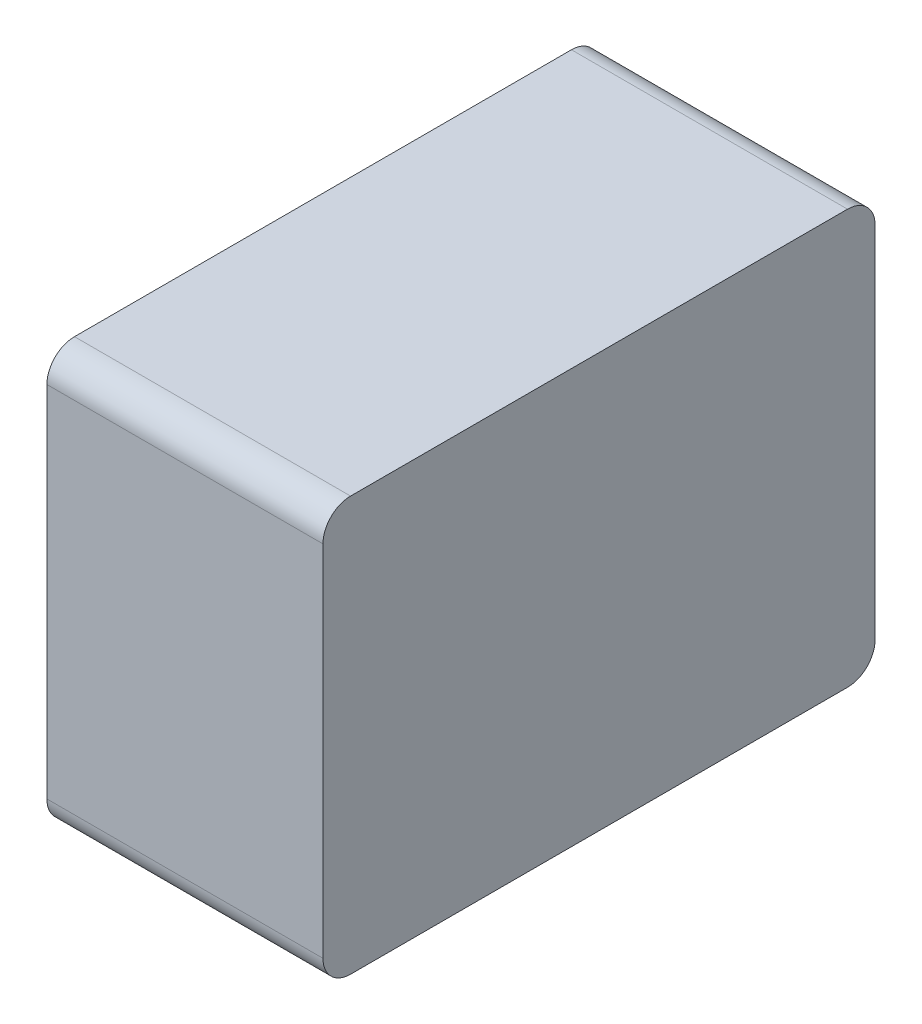
ISO-10303-21;
HEADER;
FILE_DESCRIPTION(('STEP AP214'),'2;1');
FILE_NAME('part.step','',(''),(''),'','','');
FILE_SCHEMA(('AUTOMOTIVE_DESIGN { 1 0 10303 214 1 1 1 1 }'));
ENDSEC;
DATA;
#1=APPLICATION_CONTEXT('core data for automotive mechanical design processes');
#2=APPLICATION_PROTOCOL_DEFINITION('international standard','automotive_design',2000,#1);
#3=PRODUCT_CONTEXT('',#1,'mechanical');
#4=PRODUCT('Part','Part','',(#3));
#5=PRODUCT_RELATED_PRODUCT_CATEGORY('part','',(#4));
#6=PRODUCT_DEFINITION_FORMATION('','',#4);
#7=PRODUCT_DEFINITION_CONTEXT('part definition',#1,'design');
#8=PRODUCT_DEFINITION('design','',#6,#7);
#9=PRODUCT_DEFINITION_SHAPE('','',#8);
#10=(LENGTH_UNIT() NAMED_UNIT(*) SI_UNIT(.MILLI.,.METRE.));
#11=(NAMED_UNIT(*) PLANE_ANGLE_UNIT() SI_UNIT($,.RADIAN.));
#12=(NAMED_UNIT(*) SI_UNIT($,.STERADIAN.) SOLID_ANGLE_UNIT());
#13=UNCERTAINTY_MEASURE_WITH_UNIT(LENGTH_MEASURE(1.E-05),#10,'distance_accuracy_value','');
#14=(GEOMETRIC_REPRESENTATION_CONTEXT(3) GLOBAL_UNCERTAINTY_ASSIGNED_CONTEXT((#13)) GLOBAL_UNIT_ASSIGNED_CONTEXT((#10,
#11,#12)) REPRESENTATION_CONTEXT('',''));
#15=CARTESIAN_POINT('',(0.,0.,0.));
#16=DIRECTION('',(0.,0.,1.));
#17=DIRECTION('',(1.,0.,0.));
#18=AXIS2_PLACEMENT_3D('',#15,#16,#17);
#19=CARTESIAN_POINT('',(0.,0.,0.));
#20=DIRECTION('',(1.,0.,0.));
#21=DIRECTION('',(0.,0.,-1.));
#22=AXIS2_PLACEMENT_3D('',#19,#20,#21);
#23=PLANE('',#22);
#24=CARTESIAN_POINT('',(0.,52.,-72.));
#25=DIRECTION('',(1.,0.,0.));
#26=DIRECTION('',(0.,0.,-1.));
#27=AXIS2_PLACEMENT_3D('',#24,#25,#26);
#28=CIRCLE('',#27,3.);
#29=CARTESIAN_POINT('',(0.,55.,-72.));
#30=VERTEX_POINT('',#29);
#31=CARTESIAN_POINT('',(0.,52.,-75.));
#32=VERTEX_POINT('',#31);
#33=EDGE_CURVE('E337',#30,#32,#28,.F.);
#34=ORIENTED_EDGE('',*,*,#33,.F.);
#35=DIRECTION('',(0.,0.,1.));
#36=VECTOR('',#35,1.);
#37=CARTESIAN_POINT('',(0.,55.,80.));
#38=LINE('',#37,#36);
#39=CARTESIAN_POINT('',(0.,55.,72.));
#40=VERTEX_POINT('',#39);
#41=EDGE_CURVE('E306',#30,#40,#38,.T.);
#42=ORIENTED_EDGE('',*,*,#41,.T.);
#43=CARTESIAN_POINT('',(0.,52.,72.));
#44=DIRECTION('',(1.,0.,0.));
#45=DIRECTION('',(0.,0.,-1.));
#46=AXIS2_PLACEMENT_3D('',#43,#44,#45);
#47=CIRCLE('',#46,3.);
#48=CARTESIAN_POINT('',(0.,52.,75.));
#49=VERTEX_POINT('',#48);
#50=EDGE_CURVE('E347',#49,#40,#47,.F.);
#51=ORIENTED_EDGE('',*,*,#50,.F.);
#52=DIRECTION('',(0.,-1.,0.));
#53=VECTOR('',#52,1.);
#54=CARTESIAN_POINT('',(0.,60.,75.));
#55=LINE('',#54,#53);
#56=CARTESIAN_POINT('',(0.,15.,75.));
#57=VERTEX_POINT('',#56);
#58=EDGE_CURVE('E343',#49,#57,#55,.T.);
#59=ORIENTED_EDGE('',*,*,#58,.T.);
#60=DIRECTION('',(0.,-1.,0.));
#61=VECTOR('',#60,1.);
#62=CARTESIAN_POINT('',(0.,60.,75.));
#63=LINE('',#62,#61);
#64=CARTESIAN_POINT('',(0.,-15.,75.));
#65=VERTEX_POINT('',#64);
#66=EDGE_CURVE('E243',#57,#65,#63,.T.);
#67=ORIENTED_EDGE('',*,*,#66,.T.);
#68=CARTESIAN_POINT('',(0.,-52.,75.));
#69=VERTEX_POINT('',#68);
#70=EDGE_CURVE('E301',#65,#69,#55,.T.);
#71=ORIENTED_EDGE('',*,*,#70,.T.);
#72=CARTESIAN_POINT('',(0.,-52.,72.));
#73=DIRECTION('',(1.,0.,0.));
#74=DIRECTION('',(0.,0.,-1.));
#75=AXIS2_PLACEMENT_3D('',#72,#73,#74);
#76=CIRCLE('',#75,3.);
#77=CARTESIAN_POINT('',(0.,-55.,72.));
#78=VERTEX_POINT('',#77);
#79=EDGE_CURVE('E341',#78,#69,#76,.F.);
#80=ORIENTED_EDGE('',*,*,#79,.F.);
#81=DIRECTION('',(0.,0.,-1.));
#82=VECTOR('',#81,1.);
#83=CARTESIAN_POINT('',(0.,-55.,80.));
#84=LINE('',#83,#82);
#85=CARTESIAN_POINT('',(0.,-55.,-72.0000000000001));
#86=VERTEX_POINT('',#85);
#87=EDGE_CURVE('E346',#78,#86,#84,.T.);
#88=ORIENTED_EDGE('',*,*,#87,.T.);
#89=CARTESIAN_POINT('',(0.,-52.,-72.0000000000001));
#90=DIRECTION('',(1.,0.,0.));
#91=DIRECTION('',(0.,0.,-1.));
#92=AXIS2_PLACEMENT_3D('',#89,#90,#91);
#93=CIRCLE('',#92,3.);
#94=CARTESIAN_POINT('',(0.,-52.,-75.0000000000001));
#95=VERTEX_POINT('',#94);
#96=EDGE_CURVE('E349',#95,#86,#93,.F.);
#97=ORIENTED_EDGE('',*,*,#96,.F.);
#98=DIRECTION('',(0.,1.,0.));
#99=VECTOR('',#98,1.);
#100=CARTESIAN_POINT('',(0.,60.,-75.));
#101=LINE('',#100,#99);
#102=CARTESIAN_POINT('',(0.,-15.,-75.));
#103=VERTEX_POINT('',#102);
#104=EDGE_CURVE('E352',#95,#103,#101,.T.);
#105=ORIENTED_EDGE('',*,*,#104,.T.);
#106=DIRECTION('',(0.,-1.,0.));
#107=VECTOR('',#106,1.);
#108=CARTESIAN_POINT('',(0.,60.,-75.));
#109=LINE('',#108,#107);
#110=CARTESIAN_POINT('',(0.,15.,-75.));
#111=VERTEX_POINT('',#110);
#112=EDGE_CURVE('E240',#111,#103,#109,.T.);
#113=ORIENTED_EDGE('',*,*,#112,.F.);
#114=EDGE_CURVE('E357',#111,#32,#101,.T.);
#115=ORIENTED_EDGE('',*,*,#114,.T.);
#116=EDGE_LOOP('',(#34,#42,#51,#59,#67,#71,#80,#88,#97,#105,#113,#115));
#117=FACE_BOUND('',#116,.T.);
#118=DIRECTION('',(0.,-1.,0.));
#119=VECTOR('',#118,1.);
#120=CARTESIAN_POINT('',(0.,-57.,25.));
#121=LINE('',#120,#119);
#122=CARTESIAN_POINT('',(0.,-60.,25.));
#123=VERTEX_POINT('',#122);
#124=CARTESIAN_POINT('',(0.,-57.,25.));
#125=VERTEX_POINT('',#124);
#126=EDGE_CURVE('E201',#123,#125,#121,.F.);
#127=ORIENTED_EDGE('',*,*,#126,.F.);
#128=DIRECTION('',(0.,0.,-1.));
#129=VECTOR('',#128,1.);
#130=CARTESIAN_POINT('',(0.,-60.,80.));
#131=LINE('',#130,#129);
#132=CARTESIAN_POINT('',(0.,-60.,72.));
#133=VERTEX_POINT('',#132);
#134=EDGE_CURVE('E379',#133,#123,#131,.T.);
#135=ORIENTED_EDGE('',*,*,#134,.F.);
#136=CARTESIAN_POINT('',(0.,-52.,72.));
#137=DIRECTION('',(1.,0.,0.));
#138=DIRECTION('',(0.,0.,-1.));
#139=AXIS2_PLACEMENT_3D('',#136,#137,#138);
#140=CIRCLE('',#139,8.);
#141=CARTESIAN_POINT('',(0.,-52.,80.));
#142=VERTEX_POINT('',#141);
#143=EDGE_CURVE('E390',#133,#142,#140,.F.);
#144=ORIENTED_EDGE('',*,*,#143,.T.);
#145=DIRECTION('',(0.,-1.,0.));
#146=VECTOR('',#145,1.);
#147=CARTESIAN_POINT('',(0.,60.,80.));
#148=LINE('',#147,#146);
#149=CARTESIAN_POINT('',(0.,52.,80.));
#150=VERTEX_POINT('',#149);
#151=EDGE_CURVE('E310',#150,#142,#148,.T.);
#152=ORIENTED_EDGE('',*,*,#151,.F.);
#153=CARTESIAN_POINT('',(0.,52.,72.));
#154=DIRECTION('',(1.,0.,0.));
#155=DIRECTION('',(0.,0.,-1.));
#156=AXIS2_PLACEMENT_3D('',#153,#154,#155);
#157=CIRCLE('',#156,8.);
#158=CARTESIAN_POINT('',(0.,60.,72.));
#159=VERTEX_POINT('',#158);
#160=EDGE_CURVE('E392',#150,#159,#157,.F.);
#161=ORIENTED_EDGE('',*,*,#160,.T.);
#162=DIRECTION('',(0.,0.,1.));
#163=VECTOR('',#162,1.);
#164=CARTESIAN_POINT('',(0.,60.,80.));
#165=LINE('',#164,#163);
#166=CARTESIAN_POINT('',(0.,60.,-72.));
#167=VERTEX_POINT('',#166);
#168=EDGE_CURVE('E367',#167,#159,#165,.T.);
#169=ORIENTED_EDGE('',*,*,#168,.F.);
#170=CARTESIAN_POINT('',(0.,52.,-72.));
#171=DIRECTION('',(1.,0.,0.));
#172=DIRECTION('',(0.,0.,-1.));
#173=AXIS2_PLACEMENT_3D('',#170,#171,#172);
#174=CIRCLE('',#173,8.);
#175=CARTESIAN_POINT('',(0.,52.,-80.));
#176=VERTEX_POINT('',#175);
#177=EDGE_CURVE('E396',#167,#176,#174,.F.);
#178=ORIENTED_EDGE('',*,*,#177,.T.);
#179=DIRECTION('',(0.,1.,0.));
#180=VECTOR('',#179,1.);
#181=CARTESIAN_POINT('',(0.,60.,-80.));
#182=LINE('',#181,#180);
#183=CARTESIAN_POINT('',(0.,-52.,-80.));
#184=VERTEX_POINT('',#183);
#185=EDGE_CURVE('E381',#184,#176,#182,.T.);
#186=ORIENTED_EDGE('',*,*,#185,.F.);
#187=CARTESIAN_POINT('',(0.,-52.,-72.0000000000001));
#188=DIRECTION('',(1.,0.,0.));
#189=DIRECTION('',(0.,0.,-1.));
#190=AXIS2_PLACEMENT_3D('',#187,#188,#189);
#191=CIRCLE('',#190,8.);
#192=CARTESIAN_POINT('',(0.,-60.,-72.0000000000001));
#193=VERTEX_POINT('',#192);
#194=EDGE_CURVE('E394',#184,#193,#191,.F.);
#195=ORIENTED_EDGE('',*,*,#194,.T.);
#196=CARTESIAN_POINT('',(0.,-60.,-25.));
#197=VERTEX_POINT('',#196);
#198=EDGE_CURVE('E216',#197,#193,#131,.T.);
#199=ORIENTED_EDGE('',*,*,#198,.F.);
#200=DIRECTION('',(0.,-1.,0.));
#201=VECTOR('',#200,1.);
#202=CARTESIAN_POINT('',(0.,-57.,-25.));
#203=LINE('',#202,#201);
#204=CARTESIAN_POINT('',(0.,-57.,-25.));
#205=VERTEX_POINT('',#204);
#206=EDGE_CURVE('E56',#205,#197,#203,.T.);
#207=ORIENTED_EDGE('',*,*,#206,.F.);
#208=DIRECTION('',(0.,0.,1.));
#209=VECTOR('',#208,1.);
#210=CARTESIAN_POINT('',(0.,-57.,0.));
#211=LINE('',#210,#209);
#212=EDGE_CURVE('E11',#205,#125,#211,.T.);
#213=ORIENTED_EDGE('',*,*,#212,.T.);
#214=EDGE_LOOP('',(#127,#135,#144,#152,#161,#169,#178,#186,#195,#199,#207,#213));
#215=FACE_BOUND('',#214,.T.);
#216=ADVANCED_FACE('F41',(#117,#215),#23,.F.);
#217=CARTESIAN_POINT('',(80.,60.,80.));
#218=DIRECTION('',(0.,0.,-1.));
#219=DIRECTION('',(0.,1.,0.));
#220=AXIS2_PLACEMENT_3D('',#217,#218,#219);
#221=PLANE('',#220);
#222=DIRECTION('',(0.,-1.,0.));
#223=VECTOR('',#222,1.);
#224=CARTESIAN_POINT('',(80.,60.,80.));
#225=LINE('',#224,#223);
#226=CARTESIAN_POINT('',(80.,52.,80.));
#227=VERTEX_POINT('',#226);
#228=CARTESIAN_POINT('',(80.,-52.,80.));
#229=VERTEX_POINT('',#228);
#230=EDGE_CURVE('E363',#227,#229,#225,.T.);
#231=ORIENTED_EDGE('',*,*,#230,.F.);
#232=DIRECTION('',(-1.,0.,0.));
#233=VECTOR('',#232,1.);
#234=CARTESIAN_POINT('',(80.,52.,80.));
#235=LINE('',#234,#233);
#236=EDGE_CURVE('E418',#227,#150,#235,.T.);
#237=ORIENTED_EDGE('',*,*,#236,.T.);
#238=ORIENTED_EDGE('',*,*,#151,.T.);
#239=DIRECTION('',(-1.,0.,0.));
#240=VECTOR('',#239,1.);
#241=CARTESIAN_POINT('',(80.,-52.,80.));
#242=LINE('',#241,#240);
#243=EDGE_CURVE('E416',#142,#229,#242,.F.);
#244=ORIENTED_EDGE('',*,*,#243,.T.);
#245=EDGE_LOOP('',(#231,#237,#238,#244));
#246=FACE_BOUND('',#245,.T.);
#247=ADVANCED_FACE('F506',(#246),#221,.F.);
#248=CARTESIAN_POINT('',(80.,-60.,80.));
#249=DIRECTION('',(0.,1.,0.));
#250=DIRECTION('',(0.,0.,1.));
#251=AXIS2_PLACEMENT_3D('',#248,#249,#250);
#252=PLANE('',#251);
#253=CARTESIAN_POINT('',(0.,-60.,0.));
#254=DIRECTION('',(0.,1.,0.));
#255=DIRECTION('',(0.,0.,1.));
#256=AXIS2_PLACEMENT_3D('',#253,#254,#255);
#257=CIRCLE('',#256,25.);
#258=EDGE_CURVE('E205',#123,#197,#257,.T.);
#259=ORIENTED_EDGE('',*,*,#258,.T.);
#260=ORIENTED_EDGE('',*,*,#198,.T.);
#261=DIRECTION('',(-1.,0.,0.));
#262=VECTOR('',#261,1.);
#263=CARTESIAN_POINT('',(80.,-60.,-72.0000000000001));
#264=LINE('',#263,#262);
#265=CARTESIAN_POINT('',(80.,-60.,-72.0000000000001));
#266=VERTEX_POINT('',#265);
#267=EDGE_CURVE('E414',#193,#266,#264,.F.);
#268=ORIENTED_EDGE('',*,*,#267,.T.);
#269=DIRECTION('',(0.,0.,-1.));
#270=VECTOR('',#269,1.);
#271=CARTESIAN_POINT('',(80.,-60.,80.));
#272=LINE('',#271,#270);
#273=CARTESIAN_POINT('',(80.,-60.,72.));
#274=VERTEX_POINT('',#273);
#275=EDGE_CURVE('E366',#274,#266,#272,.T.);
#276=ORIENTED_EDGE('',*,*,#275,.F.);
#277=DIRECTION('',(-1.,0.,0.));
#278=VECTOR('',#277,1.);
#279=CARTESIAN_POINT('',(80.,-60.,72.));
#280=LINE('',#279,#278);
#281=EDGE_CURVE('E411',#274,#133,#280,.T.);
#282=ORIENTED_EDGE('',*,*,#281,.T.);
#283=ORIENTED_EDGE('',*,*,#134,.T.);
#284=EDGE_LOOP('',(#259,#260,#268,#276,#282,#283));
#285=FACE_BOUND('',#284,.T.);
#286=ADVANCED_FACE('F511',(#285),#252,.F.);
#287=CARTESIAN_POINT('',(80.,60.,-80.));
#288=DIRECTION('',(0.,0.,1.));
#289=DIRECTION('',(0.,-1.,0.));
#290=AXIS2_PLACEMENT_3D('',#287,#288,#289);
#291=PLANE('',#290);
#292=ORIENTED_EDGE('',*,*,#185,.T.);
#293=DIRECTION('',(-1.,0.,0.));
#294=VECTOR('',#293,1.);
#295=CARTESIAN_POINT('',(80.,52.,-80.));
#296=LINE('',#295,#294);
#297=CARTESIAN_POINT('',(80.,52.,-80.));
#298=VERTEX_POINT('',#297);
#299=EDGE_CURVE('E401',#176,#298,#296,.F.);
#300=ORIENTED_EDGE('',*,*,#299,.T.);
#301=DIRECTION('',(0.,1.,0.));
#302=VECTOR('',#301,1.);
#303=CARTESIAN_POINT('',(80.,60.,-80.));
#304=LINE('',#303,#302);
#305=CARTESIAN_POINT('',(80.,-52.,-80.));
#306=VERTEX_POINT('',#305);
#307=EDGE_CURVE('E370',#306,#298,#304,.T.);
#308=ORIENTED_EDGE('',*,*,#307,.F.);
#309=DIRECTION('',(-1.,0.,0.));
#310=VECTOR('',#309,1.);
#311=CARTESIAN_POINT('',(80.,-52.,-80.));
#312=LINE('',#311,#310);
#313=EDGE_CURVE('E398',#306,#184,#312,.T.);
#314=ORIENTED_EDGE('',*,*,#313,.T.);
#315=EDGE_LOOP('',(#292,#300,#308,#314));
#316=FACE_BOUND('',#315,.T.);
#317=ADVANCED_FACE('F521',(#316),#291,.F.);
#318=CARTESIAN_POINT('',(80.,60.,80.));
#319=DIRECTION('',(0.,-1.,0.));
#320=DIRECTION('',(0.,0.,-1.));
#321=AXIS2_PLACEMENT_3D('',#318,#319,#320);
#322=PLANE('',#321);
#323=DIRECTION('',(0.,0.,1.));
#324=VECTOR('',#323,1.);
#325=CARTESIAN_POINT('',(80.,60.,80.));
#326=LINE('',#325,#324);
#327=CARTESIAN_POINT('',(80.,60.,-72.));
#328=VERTEX_POINT('',#327);
#329=CARTESIAN_POINT('',(80.,60.,72.));
#330=VERTEX_POINT('',#329);
#331=EDGE_CURVE('E373',#328,#330,#326,.T.);
#332=ORIENTED_EDGE('',*,*,#331,.F.);
#333=DIRECTION('',(-1.,0.,0.));
#334=VECTOR('',#333,1.);
#335=CARTESIAN_POINT('',(80.,60.,-72.));
#336=LINE('',#335,#334);
#337=EDGE_CURVE('E387',#328,#167,#336,.T.);
#338=ORIENTED_EDGE('',*,*,#337,.T.);
#339=ORIENTED_EDGE('',*,*,#168,.T.);
#340=DIRECTION('',(-1.,0.,0.));
#341=VECTOR('',#340,1.);
#342=CARTESIAN_POINT('',(80.,60.,72.));
#343=LINE('',#342,#341);
#344=EDGE_CURVE('E376',#159,#330,#343,.F.);
#345=ORIENTED_EDGE('',*,*,#344,.T.);
#346=EDGE_LOOP('',(#332,#338,#339,#345));
#347=FACE_BOUND('',#346,.T.);
#348=ADVANCED_FACE('F518',(#347),#322,.F.);
#349=CARTESIAN_POINT('',(80.,0.,0.));
#350=DIRECTION('',(1.,0.,0.));
#351=DIRECTION('',(0.,0.,-1.));
#352=AXIS2_PLACEMENT_3D('',#349,#350,#351);
#353=PLANE('',#352);
#354=ORIENTED_EDGE('',*,*,#307,.T.);
#355=CARTESIAN_POINT('',(80.,52.,-72.));
#356=DIRECTION('',(1.,0.,0.));
#357=DIRECTION('',(0.,0.,-1.));
#358=AXIS2_PLACEMENT_3D('',#355,#356,#357);
#359=CIRCLE('',#358,8.);
#360=EDGE_CURVE('E409',#298,#328,#359,.T.);
#361=ORIENTED_EDGE('',*,*,#360,.T.);
#362=ORIENTED_EDGE('',*,*,#331,.T.);
#363=CARTESIAN_POINT('',(80.,52.,72.));
#364=DIRECTION('',(1.,0.,0.));
#365=DIRECTION('',(0.,0.,-1.));
#366=AXIS2_PLACEMENT_3D('',#363,#364,#365);
#367=CIRCLE('',#366,8.);
#368=EDGE_CURVE('E405',#330,#227,#367,.T.);
#369=ORIENTED_EDGE('',*,*,#368,.T.);
#370=ORIENTED_EDGE('',*,*,#230,.T.);
#371=CARTESIAN_POINT('',(80.,-52.,72.));
#372=DIRECTION('',(1.,0.,0.));
#373=DIRECTION('',(0.,0.,-1.));
#374=AXIS2_PLACEMENT_3D('',#371,#372,#373);
#375=CIRCLE('',#374,8.);
#376=EDGE_CURVE('E403',#229,#274,#375,.T.);
#377=ORIENTED_EDGE('',*,*,#376,.T.);
#378=ORIENTED_EDGE('',*,*,#275,.T.);
#379=CARTESIAN_POINT('',(80.,-52.,-72.0000000000001));
#380=DIRECTION('',(1.,0.,0.));
#381=DIRECTION('',(0.,0.,-1.));
#382=AXIS2_PLACEMENT_3D('',#379,#380,#381);
#383=CIRCLE('',#382,8.);
#384=EDGE_CURVE('E407',#266,#306,#383,.T.);
#385=ORIENTED_EDGE('',*,*,#384,.T.);
#386=EDGE_LOOP('',(#354,#361,#362,#369,#370,#377,#378,#385));
#387=FACE_BOUND('',#386,.T.);
#388=ADVANCED_FACE('F516',(#387),#353,.T.);
#389=CARTESIAN_POINT('',(80.,52.,-72.));
#390=DIRECTION('',(-1.,0.,0.));
#391=DIRECTION('',(0.,0.,1.));
#392=AXIS2_PLACEMENT_3D('',#389,#390,#391);
#393=CYLINDRICAL_SURFACE('',#392,8.);
#394=ORIENTED_EDGE('',*,*,#360,.F.);
#395=ORIENTED_EDGE('',*,*,#299,.F.);
#396=ORIENTED_EDGE('',*,*,#177,.F.);
#397=ORIENTED_EDGE('',*,*,#337,.F.);
#398=EDGE_LOOP('',(#394,#395,#396,#397));
#399=FACE_BOUND('',#398,.T.);
#400=ADVANCED_FACE('F529',(#399),#393,.T.);
#401=CARTESIAN_POINT('',(80.,-52.,-72.0000000000001));
#402=DIRECTION('',(-1.,0.,0.));
#403=DIRECTION('',(0.,0.,1.));
#404=AXIS2_PLACEMENT_3D('',#401,#402,#403);
#405=CYLINDRICAL_SURFACE('',#404,8.);
#406=ORIENTED_EDGE('',*,*,#384,.F.);
#407=ORIENTED_EDGE('',*,*,#267,.F.);
#408=ORIENTED_EDGE('',*,*,#194,.F.);
#409=ORIENTED_EDGE('',*,*,#313,.F.);
#410=EDGE_LOOP('',(#406,#407,#408,#409));
#411=FACE_BOUND('',#410,.T.);
#412=ADVANCED_FACE('F532',(#411),#405,.T.);
#413=CARTESIAN_POINT('',(80.,52.,72.));
#414=DIRECTION('',(-1.,0.,0.));
#415=DIRECTION('',(0.,0.,1.));
#416=AXIS2_PLACEMENT_3D('',#413,#414,#415);
#417=CYLINDRICAL_SURFACE('',#416,8.);
#418=ORIENTED_EDGE('',*,*,#368,.F.);
#419=ORIENTED_EDGE('',*,*,#344,.F.);
#420=ORIENTED_EDGE('',*,*,#160,.F.);
#421=ORIENTED_EDGE('',*,*,#236,.F.);
#422=EDGE_LOOP('',(#418,#419,#420,#421));
#423=FACE_BOUND('',#422,.T.);
#424=ADVANCED_FACE('F535',(#423),#417,.T.);
#425=CARTESIAN_POINT('',(80.,-52.,72.));
#426=DIRECTION('',(-1.,0.,0.));
#427=DIRECTION('',(0.,0.,1.));
#428=AXIS2_PLACEMENT_3D('',#425,#426,#427);
#429=CYLINDRICAL_SURFACE('',#428,8.);
#430=ORIENTED_EDGE('',*,*,#376,.F.);
#431=ORIENTED_EDGE('',*,*,#243,.F.);
#432=ORIENTED_EDGE('',*,*,#143,.F.);
#433=ORIENTED_EDGE('',*,*,#281,.F.);
#434=EDGE_LOOP('',(#430,#431,#432,#433));
#435=FACE_BOUND('',#434,.T.);
#436=ADVANCED_FACE('F43',(#435),#429,.T.);
#437=CARTESIAN_POINT('',(80.,60.,75.));
#438=DIRECTION('',(0.,0.,-1.));
#439=DIRECTION('',(0.,1.,0.));
#440=AXIS2_PLACEMENT_3D('',#437,#438,#439);
#441=PLANE('',#440);
#442=DIRECTION('',(-1.,0.,0.));
#443=VECTOR('',#442,1.);
#444=CARTESIAN_POINT('',(80.,15.,75.));
#445=LINE('',#444,#443);
#446=CARTESIAN_POINT('',(3.00000000000001,15.,75.));
#447=VERTEX_POINT('',#446);
#448=EDGE_CURVE('E249',#447,#57,#445,.T.);
#449=ORIENTED_EDGE('',*,*,#448,.T.);
#450=ORIENTED_EDGE('',*,*,#58,.F.);
#451=DIRECTION('',(1.,0.,0.));
#452=VECTOR('',#451,1.);
#453=CARTESIAN_POINT('',(80.,52.,75.));
#454=LINE('',#453,#452);
#455=CARTESIAN_POINT('',(75.,52.,75.));
#456=VERTEX_POINT('',#455);
#457=EDGE_CURVE('E307',#456,#49,#454,.F.);
#458=ORIENTED_EDGE('',*,*,#457,.F.);
#459=DIRECTION('',(0.,-1.,0.));
#460=VECTOR('',#459,1.);
#461=CARTESIAN_POINT('',(75.,60.,75.));
#462=LINE('',#461,#460);
#463=CARTESIAN_POINT('',(75.,-52.,75.));
#464=VERTEX_POINT('',#463);
#465=EDGE_CURVE('E302',#456,#464,#462,.T.);
#466=ORIENTED_EDGE('',*,*,#465,.T.);
#467=DIRECTION('',(1.,0.,0.));
#468=VECTOR('',#467,1.);
#469=CARTESIAN_POINT('',(80.,-52.,75.));
#470=LINE('',#469,#468);
#471=EDGE_CURVE('E311',#69,#464,#470,.T.);
#472=ORIENTED_EDGE('',*,*,#471,.F.);
#473=ORIENTED_EDGE('',*,*,#70,.F.);
#474=DIRECTION('',(1.,0.,0.));
#475=VECTOR('',#474,1.);
#476=CARTESIAN_POINT('',(80.,-15.,75.));
#477=LINE('',#476,#475);
#478=CARTESIAN_POINT('',(3.,-15.,75.));
#479=VERTEX_POINT('',#478);
#480=EDGE_CURVE('E245',#65,#479,#477,.T.);
#481=ORIENTED_EDGE('',*,*,#480,.T.);
#482=DIRECTION('',(0.,1.,0.));
#483=VECTOR('',#482,1.);
#484=CARTESIAN_POINT('',(3.,60.,75.));
#485=LINE('',#484,#483);
#486=EDGE_CURVE('E247',#479,#447,#485,.T.);
#487=ORIENTED_EDGE('',*,*,#486,.T.);
#488=EDGE_LOOP('',(#449,#450,#458,#466,#472,#473,#481,#487));
#489=FACE_BOUND('',#488,.T.);
#490=ADVANCED_FACE('F473',(#489),#441,.T.);
#491=CARTESIAN_POINT('',(80.,-55.,80.));
#492=DIRECTION('',(0.,1.,0.));
#493=DIRECTION('',(0.,0.,1.));
#494=AXIS2_PLACEMENT_3D('',#491,#492,#493);
#495=PLANE('',#494);
#496=ORIENTED_EDGE('',*,*,#87,.F.);
#497=DIRECTION('',(1.,0.,0.));
#498=VECTOR('',#497,1.);
#499=CARTESIAN_POINT('',(80.,-55.,72.));
#500=LINE('',#499,#498);
#501=CARTESIAN_POINT('',(75.,-55.,72.));
#502=VERTEX_POINT('',#501);
#503=EDGE_CURVE('E320',#502,#78,#500,.F.);
#504=ORIENTED_EDGE('',*,*,#503,.F.);
#505=DIRECTION('',(0.,0.,-1.));
#506=VECTOR('',#505,1.);
#507=CARTESIAN_POINT('',(75.,-55.,80.));
#508=LINE('',#507,#506);
#509=CARTESIAN_POINT('',(75.,-55.,-72.0000000000001));
#510=VERTEX_POINT('',#509);
#511=EDGE_CURVE('E305',#502,#510,#508,.T.);
#512=ORIENTED_EDGE('',*,*,#511,.T.);
#513=DIRECTION('',(1.,0.,0.));
#514=VECTOR('',#513,1.);
#515=CARTESIAN_POINT('',(80.,-55.,-72.0000000000001));
#516=LINE('',#515,#514);
#517=EDGE_CURVE('E313',#86,#510,#516,.T.);
#518=ORIENTED_EDGE('',*,*,#517,.F.);
#519=EDGE_LOOP('',(#496,#504,#512,#518));
#520=FACE_BOUND('',#519,.T.);
#521=ADVANCED_FACE('F462',(#520),#495,.T.);
#522=CARTESIAN_POINT('',(80.,60.,-75.));
#523=DIRECTION('',(0.,0.,1.));
#524=DIRECTION('',(0.,-1.,0.));
#525=AXIS2_PLACEMENT_3D('',#522,#523,#524);
#526=PLANE('',#525);
#527=DIRECTION('',(-1.,0.,0.));
#528=VECTOR('',#527,1.);
#529=CARTESIAN_POINT('',(80.,15.,-75.));
#530=LINE('',#529,#528);
#531=CARTESIAN_POINT('',(3.00000000000003,15.,-75.));
#532=VERTEX_POINT('',#531);
#533=EDGE_CURVE('E64',#532,#111,#530,.T.);
#534=ORIENTED_EDGE('',*,*,#533,.F.);
#535=DIRECTION('',(0.,1.,0.));
#536=VECTOR('',#535,1.);
#537=CARTESIAN_POINT('',(3.,60.,-75.));
#538=LINE('',#537,#536);
#539=CARTESIAN_POINT('',(3.,-15.,-75.));
#540=VERTEX_POINT('',#539);
#541=EDGE_CURVE('E233',#540,#532,#538,.T.);
#542=ORIENTED_EDGE('',*,*,#541,.F.);
#543=DIRECTION('',(1.,0.,0.));
#544=VECTOR('',#543,1.);
#545=CARTESIAN_POINT('',(80.,-15.,-75.));
#546=LINE('',#545,#544);
#547=EDGE_CURVE('E209',#103,#540,#546,.T.);
#548=ORIENTED_EDGE('',*,*,#547,.F.);
#549=ORIENTED_EDGE('',*,*,#104,.F.);
#550=DIRECTION('',(1.,0.,0.));
#551=VECTOR('',#550,1.);
#552=CARTESIAN_POINT('',(80.,-52.,-75.));
#553=LINE('',#552,#551);
#554=CARTESIAN_POINT('',(75.,-52.,-75.));
#555=VERTEX_POINT('',#554);
#556=EDGE_CURVE('E335',#555,#95,#553,.F.);
#557=ORIENTED_EDGE('',*,*,#556,.F.);
#558=DIRECTION('',(0.,1.,0.));
#559=VECTOR('',#558,1.);
#560=CARTESIAN_POINT('',(75.,60.,-75.));
#561=LINE('',#560,#559);
#562=CARTESIAN_POINT('',(75.,52.,-75.));
#563=VERTEX_POINT('',#562);
#564=EDGE_CURVE('E314',#555,#563,#561,.T.);
#565=ORIENTED_EDGE('',*,*,#564,.T.);
#566=DIRECTION('',(1.,0.,0.));
#567=VECTOR('',#566,1.);
#568=CARTESIAN_POINT('',(80.,52.,-75.));
#569=LINE('',#568,#567);
#570=EDGE_CURVE('E329',#32,#563,#569,.T.);
#571=ORIENTED_EDGE('',*,*,#570,.F.);
#572=ORIENTED_EDGE('',*,*,#114,.F.);
#573=EDGE_LOOP('',(#534,#542,#548,#549,#557,#565,#571,#572));
#574=FACE_BOUND('',#573,.T.);
#575=ADVANCED_FACE('F454',(#574),#526,.T.);
#576=CARTESIAN_POINT('',(80.,55.,80.));
#577=DIRECTION('',(0.,-1.,0.));
#578=DIRECTION('',(0.,0.,-1.));
#579=AXIS2_PLACEMENT_3D('',#576,#577,#578);
#580=PLANE('',#579);
#581=DIRECTION('',(0.,0.,1.));
#582=VECTOR('',#581,1.);
#583=CARTESIAN_POINT('',(75.,55.,80.));
#584=LINE('',#583,#582);
#585=CARTESIAN_POINT('',(75.,55.,-72.));
#586=VERTEX_POINT('',#585);
#587=CARTESIAN_POINT('',(75.,55.,72.));
#588=VERTEX_POINT('',#587);
#589=EDGE_CURVE('E317',#586,#588,#584,.T.);
#590=ORIENTED_EDGE('',*,*,#589,.T.);
#591=DIRECTION('',(1.,0.,0.));
#592=VECTOR('',#591,1.);
#593=CARTESIAN_POINT('',(80.,55.,72.));
#594=LINE('',#593,#592);
#595=EDGE_CURVE('E324',#40,#588,#594,.T.);
#596=ORIENTED_EDGE('',*,*,#595,.F.);
#597=ORIENTED_EDGE('',*,*,#41,.F.);
#598=DIRECTION('',(1.,0.,0.));
#599=VECTOR('',#598,1.);
#600=CARTESIAN_POINT('',(80.,55.,-72.));
#601=LINE('',#600,#599);
#602=EDGE_CURVE('E339',#586,#30,#601,.F.);
#603=ORIENTED_EDGE('',*,*,#602,.F.);
#604=EDGE_LOOP('',(#590,#596,#597,#603));
#605=FACE_BOUND('',#604,.T.);
#606=ADVANCED_FACE('F438',(#605),#580,.T.);
#607=CARTESIAN_POINT('',(75.,0.,0.));
#608=DIRECTION('',(1.,0.,0.));
#609=DIRECTION('',(0.,0.,-1.));
#610=AXIS2_PLACEMENT_3D('',#607,#608,#609);
#611=PLANE('',#610);
#612=CARTESIAN_POINT('',(75.,-26.5,-45.));
#613=DIRECTION('',(1.,0.,0.));
#614=DIRECTION('',(0.,0.,-1.));
#615=AXIS2_PLACEMENT_3D('',#612,#613,#614);
#616=CIRCLE('',#615,3.);
#617=CARTESIAN_POINT('',(75.,-26.5,-48.));
#618=VERTEX_POINT('',#617);
#619=EDGE_CURVE('E49',#618,#618,#616,.F.);
#620=ORIENTED_EDGE('',*,*,#619,.F.);
#621=EDGE_LOOP('',(#620));
#622=FACE_BOUND('',#621,.T.);
#623=CARTESIAN_POINT('',(75.,-26.5,39.5));
#624=DIRECTION('',(1.,0.,0.));
#625=DIRECTION('',(0.,0.,-1.));
#626=AXIS2_PLACEMENT_3D('',#623,#624,#625);
#627=CIRCLE('',#626,3.);
#628=CARTESIAN_POINT('',(75.,-26.5,36.5));
#629=VERTEX_POINT('',#628);
#630=EDGE_CURVE('E427',#629,#629,#627,.F.);
#631=ORIENTED_EDGE('',*,*,#630,.F.);
#632=EDGE_LOOP('',(#631));
#633=FACE_BOUND('',#632,.T.);
#634=CARTESIAN_POINT('',(75.,45.,39.5));
#635=DIRECTION('',(1.,0.,0.));
#636=DIRECTION('',(0.,0.,-1.));
#637=AXIS2_PLACEMENT_3D('',#634,#635,#636);
#638=CIRCLE('',#637,3.);
#639=CARTESIAN_POINT('',(75.,45.,36.5));
#640=VERTEX_POINT('',#639);
#641=EDGE_CURVE('E424',#640,#640,#638,.F.);
#642=ORIENTED_EDGE('',*,*,#641,.F.);
#643=EDGE_LOOP('',(#642));
#644=FACE_BOUND('',#643,.T.);
#645=CARTESIAN_POINT('',(75.,45.,-45.));
#646=DIRECTION('',(1.,0.,0.));
#647=DIRECTION('',(0.,0.,-1.));
#648=AXIS2_PLACEMENT_3D('',#645,#646,#647);
#649=CIRCLE('',#648,3.);
#650=CARTESIAN_POINT('',(75.,45.,-48.));
#651=VERTEX_POINT('',#650);
#652=EDGE_CURVE('E421',#651,#651,#649,.F.);
#653=ORIENTED_EDGE('',*,*,#652,.F.);
#654=EDGE_LOOP('',(#653));
#655=FACE_BOUND('',#654,.T.);
#656=ORIENTED_EDGE('',*,*,#564,.F.);
#657=CARTESIAN_POINT('',(75.,-52.,-72.0000000000001));
#658=DIRECTION('',(1.,0.,0.));
#659=DIRECTION('',(0.,0.,-1.));
#660=AXIS2_PLACEMENT_3D('',#657,#658,#659);
#661=CIRCLE('',#660,3.);
#662=EDGE_CURVE('E321',#510,#555,#661,.T.);
#663=ORIENTED_EDGE('',*,*,#662,.F.);
#664=ORIENTED_EDGE('',*,*,#511,.F.);
#665=CARTESIAN_POINT('',(75.,-52.,72.));
#666=DIRECTION('',(1.,0.,0.));
#667=DIRECTION('',(0.,0.,-1.));
#668=AXIS2_PLACEMENT_3D('',#665,#666,#667);
#669=CIRCLE('',#668,3.);
#670=EDGE_CURVE('E327',#464,#502,#669,.T.);
#671=ORIENTED_EDGE('',*,*,#670,.F.);
#672=ORIENTED_EDGE('',*,*,#465,.F.);
#673=CARTESIAN_POINT('',(75.,52.,72.));
#674=DIRECTION('',(1.,0.,0.));
#675=DIRECTION('',(0.,0.,-1.));
#676=AXIS2_PLACEMENT_3D('',#673,#674,#675);
#677=CIRCLE('',#676,3.);
#678=EDGE_CURVE('E325',#588,#456,#677,.T.);
#679=ORIENTED_EDGE('',*,*,#678,.F.);
#680=ORIENTED_EDGE('',*,*,#589,.F.);
#681=CARTESIAN_POINT('',(75.,52.,-72.));
#682=DIRECTION('',(1.,0.,0.));
#683=DIRECTION('',(0.,0.,-1.));
#684=AXIS2_PLACEMENT_3D('',#681,#682,#683);
#685=CIRCLE('',#684,3.);
#686=EDGE_CURVE('E318',#563,#586,#685,.T.);
#687=ORIENTED_EDGE('',*,*,#686,.F.);
#688=EDGE_LOOP('',(#656,#663,#664,#671,#672,#679,#680,#687));
#689=FACE_BOUND('',#688,.T.);
#690=ADVANCED_FACE('F434',(#622,#633,#644,#655,#689),#611,.F.);
#691=CARTESIAN_POINT('',(80.,52.,-72.));
#692=DIRECTION('',(-1.,0.,0.));
#693=DIRECTION('',(0.,0.,1.));
#694=AXIS2_PLACEMENT_3D('',#691,#692,#693);
#695=CYLINDRICAL_SURFACE('',#694,3.);
#696=ORIENTED_EDGE('',*,*,#686,.T.);
#697=ORIENTED_EDGE('',*,*,#602,.T.);
#698=ORIENTED_EDGE('',*,*,#33,.T.);
#699=ORIENTED_EDGE('',*,*,#570,.T.);
#700=EDGE_LOOP('',(#696,#697,#698,#699));
#701=FACE_BOUND('',#700,.T.);
#702=ADVANCED_FACE('F437',(#701),#695,.F.);
#703=CARTESIAN_POINT('',(80.,-52.,-72.0000000000001));
#704=DIRECTION('',(-1.,0.,0.));
#705=DIRECTION('',(0.,0.,1.));
#706=AXIS2_PLACEMENT_3D('',#703,#704,#705);
#707=CYLINDRICAL_SURFACE('',#706,3.);
#708=ORIENTED_EDGE('',*,*,#662,.T.);
#709=ORIENTED_EDGE('',*,*,#556,.T.);
#710=ORIENTED_EDGE('',*,*,#96,.T.);
#711=ORIENTED_EDGE('',*,*,#517,.T.);
#712=EDGE_LOOP('',(#708,#709,#710,#711));
#713=FACE_BOUND('',#712,.T.);
#714=ADVANCED_FACE('F457',(#713),#707,.F.);
#715=CARTESIAN_POINT('',(80.,52.,72.));
#716=DIRECTION('',(-1.,0.,0.));
#717=DIRECTION('',(0.,0.,1.));
#718=AXIS2_PLACEMENT_3D('',#715,#716,#717);
#719=CYLINDRICAL_SURFACE('',#718,3.);
#720=ORIENTED_EDGE('',*,*,#678,.T.);
#721=ORIENTED_EDGE('',*,*,#457,.T.);
#722=ORIENTED_EDGE('',*,*,#50,.T.);
#723=ORIENTED_EDGE('',*,*,#595,.T.);
#724=EDGE_LOOP('',(#720,#721,#722,#723));
#725=FACE_BOUND('',#724,.T.);
#726=ADVANCED_FACE('F476',(#725),#719,.F.);
#727=CARTESIAN_POINT('',(80.,-52.,72.));
#728=DIRECTION('',(-1.,0.,0.));
#729=DIRECTION('',(0.,0.,1.));
#730=AXIS2_PLACEMENT_3D('',#727,#728,#729);
#731=CYLINDRICAL_SURFACE('',#730,3.);
#732=ORIENTED_EDGE('',*,*,#670,.T.);
#733=ORIENTED_EDGE('',*,*,#503,.T.);
#734=ORIENTED_EDGE('',*,*,#79,.T.);
#735=ORIENTED_EDGE('',*,*,#471,.T.);
#736=EDGE_LOOP('',(#732,#733,#734,#735));
#737=FACE_BOUND('',#736,.T.);
#738=ADVANCED_FACE('F468',(#737),#731,.F.);
#739=CARTESIAN_POINT('',(65.,45.,-45.));
#740=DIRECTION('',(1.,0.,0.));
#741=DIRECTION('',(0.,0.,-1.));
#742=AXIS2_PLACEMENT_3D('',#739,#740,#741);
#743=CYLINDRICAL_SURFACE('',#742,3.);
#744=CARTESIAN_POINT('',(65.,45.,-45.));
#745=DIRECTION('',(-1.,0.,0.));
#746=DIRECTION('',(0.,0.,1.));
#747=AXIS2_PLACEMENT_3D('',#744,#745,#746);
#748=CIRCLE('',#747,3.);
#749=CARTESIAN_POINT('',(65.,45.,-42.));
#750=VERTEX_POINT('',#749);
#751=EDGE_CURVE('E298',#750,#750,#748,.T.);
#752=ORIENTED_EDGE('',*,*,#751,.F.);
#753=EDGE_LOOP('',(#752));
#754=FACE_BOUND('',#753,.T.);
#755=ORIENTED_EDGE('',*,*,#652,.T.);
#756=EDGE_LOOP('',(#755));
#757=FACE_BOUND('',#756,.T.);
#758=ADVANCED_FACE('F673',(#754,#757),#743,.T.);
#759=CARTESIAN_POINT('',(65.,45.,-45.));
#760=DIRECTION('',(-1.,0.,0.));
#761=DIRECTION('',(0.,0.,1.));
#762=AXIS2_PLACEMENT_3D('',#759,#760,#761);
#763=PLANE('',#762);
#764=CARTESIAN_POINT('',(65.,45.,-45.));
#765=DIRECTION('',(-1.,0.,0.));
#766=DIRECTION('',(0.,0.,1.));
#767=AXIS2_PLACEMENT_3D('',#764,#765,#766);
#768=CIRCLE('',#767,1.2);
#769=CARTESIAN_POINT('',(65.,45.,-43.8));
#770=VERTEX_POINT('',#769);
#771=EDGE_CURVE('E269',#770,#770,#768,.T.);
#772=ORIENTED_EDGE('',*,*,#771,.F.);
#773=EDGE_LOOP('',(#772));
#774=FACE_BOUND('',#773,.T.);
#775=ORIENTED_EDGE('',*,*,#751,.T.);
#776=EDGE_LOOP('',(#775));
#777=FACE_BOUND('',#776,.T.);
#778=ADVANCED_FACE('F682',(#774,#777),#763,.T.);
#779=CARTESIAN_POINT('',(65.,45.,39.5));
#780=DIRECTION('',(1.,0.,0.));
#781=DIRECTION('',(0.,0.,-1.));
#782=AXIS2_PLACEMENT_3D('',#779,#780,#781);
#783=CYLINDRICAL_SURFACE('',#782,3.);
#784=CARTESIAN_POINT('',(65.,45.,39.5));
#785=DIRECTION('',(-1.,0.,0.));
#786=DIRECTION('',(0.,0.,1.));
#787=AXIS2_PLACEMENT_3D('',#784,#785,#786);
#788=CIRCLE('',#787,3.);
#789=CARTESIAN_POINT('',(65.,45.,42.5));
#790=VERTEX_POINT('',#789);
#791=EDGE_CURVE('E295',#790,#790,#788,.T.);
#792=ORIENTED_EDGE('',*,*,#791,.F.);
#793=EDGE_LOOP('',(#792));
#794=FACE_BOUND('',#793,.T.);
#795=ORIENTED_EDGE('',*,*,#641,.T.);
#796=EDGE_LOOP('',(#795));
#797=FACE_BOUND('',#796,.T.);
#798=ADVANCED_FACE('F693',(#794,#797),#783,.T.);
#799=CARTESIAN_POINT('',(65.,45.,39.5));
#800=DIRECTION('',(-1.,0.,0.));
#801=DIRECTION('',(0.,0.,1.));
#802=AXIS2_PLACEMENT_3D('',#799,#800,#801);
#803=PLANE('',#802);
#804=CARTESIAN_POINT('',(65.,45.,39.5));
#805=DIRECTION('',(-1.,0.,0.));
#806=DIRECTION('',(0.,0.,1.));
#807=AXIS2_PLACEMENT_3D('',#804,#805,#806);
#808=CIRCLE('',#807,1.2);
#809=CARTESIAN_POINT('',(65.,45.,40.7));
#810=VERTEX_POINT('',#809);
#811=EDGE_CURVE('E279',#810,#810,#808,.T.);
#812=ORIENTED_EDGE('',*,*,#811,.F.);
#813=EDGE_LOOP('',(#812));
#814=FACE_BOUND('',#813,.T.);
#815=ORIENTED_EDGE('',*,*,#791,.T.);
#816=EDGE_LOOP('',(#815));
#817=FACE_BOUND('',#816,.T.);
#818=ADVANCED_FACE('F705',(#814,#817),#803,.T.);
#819=CARTESIAN_POINT('',(65.,-26.5,39.5));
#820=DIRECTION('',(1.,0.,0.));
#821=DIRECTION('',(0.,0.,-1.));
#822=AXIS2_PLACEMENT_3D('',#819,#820,#821);
#823=CYLINDRICAL_SURFACE('',#822,3.);
#824=CARTESIAN_POINT('',(65.,-26.5,39.5));
#825=DIRECTION('',(-1.,0.,0.));
#826=DIRECTION('',(0.,0.,1.));
#827=AXIS2_PLACEMENT_3D('',#824,#825,#826);
#828=CIRCLE('',#827,3.);
#829=CARTESIAN_POINT('',(65.,-26.5,42.5));
#830=VERTEX_POINT('',#829);
#831=EDGE_CURVE('E292',#830,#830,#828,.T.);
#832=ORIENTED_EDGE('',*,*,#831,.F.);
#833=EDGE_LOOP('',(#832));
#834=FACE_BOUND('',#833,.T.);
#835=ORIENTED_EDGE('',*,*,#630,.T.);
#836=EDGE_LOOP('',(#835));
#837=FACE_BOUND('',#836,.T.);
#838=ADVANCED_FACE('F716',(#834,#837),#823,.T.);
#839=CARTESIAN_POINT('',(65.,-26.5,39.5));
#840=DIRECTION('',(-1.,0.,0.));
#841=DIRECTION('',(0.,0.,1.));
#842=AXIS2_PLACEMENT_3D('',#839,#840,#841);
#843=PLANE('',#842);
#844=CARTESIAN_POINT('',(65.,-26.5,39.5));
#845=DIRECTION('',(-1.,0.,0.));
#846=DIRECTION('',(0.,0.,1.));
#847=AXIS2_PLACEMENT_3D('',#844,#845,#846);
#848=CIRCLE('',#847,1.2);
#849=CARTESIAN_POINT('',(65.,-26.5,40.7));
#850=VERTEX_POINT('',#849);
#851=EDGE_CURVE('E273',#850,#850,#848,.T.);
#852=ORIENTED_EDGE('',*,*,#851,.F.);
#853=EDGE_LOOP('',(#852));
#854=FACE_BOUND('',#853,.T.);
#855=ORIENTED_EDGE('',*,*,#831,.T.);
#856=EDGE_LOOP('',(#855));
#857=FACE_BOUND('',#856,.T.);
#858=ADVANCED_FACE('F727',(#854,#857),#843,.T.);
#859=CARTESIAN_POINT('',(65.,-26.5,-45.));
#860=DIRECTION('',(1.,0.,0.));
#861=DIRECTION('',(0.,0.,-1.));
#862=AXIS2_PLACEMENT_3D('',#859,#860,#861);
#863=CYLINDRICAL_SURFACE('',#862,3.);
#864=CARTESIAN_POINT('',(65.,-26.5,-45.));
#865=DIRECTION('',(-1.,0.,0.));
#866=DIRECTION('',(0.,0.,1.));
#867=AXIS2_PLACEMENT_3D('',#864,#865,#866);
#868=CIRCLE('',#867,3.);
#869=CARTESIAN_POINT('',(65.,-26.5,-42.));
#870=VERTEX_POINT('',#869);
#871=EDGE_CURVE('E287',#870,#870,#868,.T.);
#872=ORIENTED_EDGE('',*,*,#871,.F.);
#873=EDGE_LOOP('',(#872));
#874=FACE_BOUND('',#873,.T.);
#875=ORIENTED_EDGE('',*,*,#619,.T.);
#876=EDGE_LOOP('',(#875));
#877=FACE_BOUND('',#876,.T.);
#878=ADVANCED_FACE('F432',(#874,#877),#863,.T.);
#879=CARTESIAN_POINT('',(65.,-26.5,-45.));
#880=DIRECTION('',(-1.,0.,0.));
#881=DIRECTION('',(0.,0.,1.));
#882=AXIS2_PLACEMENT_3D('',#879,#880,#881);
#883=PLANE('',#882);
#884=CARTESIAN_POINT('',(65.,-26.5,-45.));
#885=DIRECTION('',(-1.,0.,0.));
#886=DIRECTION('',(0.,0.,1.));
#887=AXIS2_PLACEMENT_3D('',#884,#885,#886);
#888=CIRCLE('',#887,1.2);
#889=CARTESIAN_POINT('',(65.,-26.5,-43.8));
#890=VERTEX_POINT('',#889);
#891=EDGE_CURVE('E266',#890,#890,#888,.T.);
#892=ORIENTED_EDGE('',*,*,#891,.F.);
#893=EDGE_LOOP('',(#892));
#894=FACE_BOUND('',#893,.T.);
#895=ORIENTED_EDGE('',*,*,#871,.T.);
#896=EDGE_LOOP('',(#895));
#897=FACE_BOUND('',#896,.T.);
#898=ADVANCED_FACE('F748',(#894,#897),#883,.T.);
#899=CARTESIAN_POINT('',(75.,-26.5,-45.));
#900=DIRECTION('',(-1.,0.,0.));
#901=DIRECTION('',(0.,0.,1.));
#902=AXIS2_PLACEMENT_3D('',#899,#900,#901);
#903=CYLINDRICAL_SURFACE('',#902,1.2);
#904=CARTESIAN_POINT('',(75.,-26.5,-45.));
#905=DIRECTION('',(-1.,0.,0.));
#906=DIRECTION('',(0.,0.,1.));
#907=AXIS2_PLACEMENT_3D('',#904,#905,#906);
#908=CIRCLE('',#907,1.2);
#909=CARTESIAN_POINT('',(75.,-26.5,-43.8));
#910=VERTEX_POINT('',#909);
#911=EDGE_CURVE('E270',#910,#910,#908,.T.);
#912=ORIENTED_EDGE('',*,*,#911,.F.);
#913=EDGE_LOOP('',(#912));
#914=FACE_BOUND('',#913,.T.);
#915=ORIENTED_EDGE('',*,*,#891,.T.);
#916=EDGE_LOOP('',(#915));
#917=FACE_BOUND('',#916,.T.);
#918=ADVANCED_FACE('F759',(#914,#917),#903,.F.);
#919=CARTESIAN_POINT('',(75.,-26.5,-45.));
#920=DIRECTION('',(-1.,0.,0.));
#921=DIRECTION('',(0.,0.,1.));
#922=AXIS2_PLACEMENT_3D('',#919,#920,#921);
#923=PLANE('',#922);
#924=ORIENTED_EDGE('',*,*,#911,.T.);
#925=EDGE_LOOP('',(#924));
#926=FACE_BOUND('',#925,.T.);
#927=ADVANCED_FACE('F770',(#926),#923,.T.);
#928=CARTESIAN_POINT('',(75.,-26.5,39.5));
#929=DIRECTION('',(-1.,0.,0.));
#930=DIRECTION('',(0.,0.,1.));
#931=AXIS2_PLACEMENT_3D('',#928,#929,#930);
#932=CYLINDRICAL_SURFACE('',#931,1.2);
#933=CARTESIAN_POINT('',(75.,-26.5,39.5));
#934=DIRECTION('',(-1.,0.,0.));
#935=DIRECTION('',(0.,0.,1.));
#936=AXIS2_PLACEMENT_3D('',#933,#934,#935);
#937=CIRCLE('',#936,1.2);
#938=CARTESIAN_POINT('',(75.,-26.5,40.7));
#939=VERTEX_POINT('',#938);
#940=EDGE_CURVE('E276',#939,#939,#937,.T.);
#941=ORIENTED_EDGE('',*,*,#940,.F.);
#942=EDGE_LOOP('',(#941));
#943=FACE_BOUND('',#942,.T.);
#944=ORIENTED_EDGE('',*,*,#851,.T.);
#945=EDGE_LOOP('',(#944));
#946=FACE_BOUND('',#945,.T.);
#947=ADVANCED_FACE('F782',(#943,#946),#932,.F.);
#948=CARTESIAN_POINT('',(75.,-26.5,39.5));
#949=DIRECTION('',(-1.,0.,0.));
#950=DIRECTION('',(0.,0.,1.));
#951=AXIS2_PLACEMENT_3D('',#948,#949,#950);
#952=PLANE('',#951);
#953=ORIENTED_EDGE('',*,*,#940,.T.);
#954=EDGE_LOOP('',(#953));
#955=FACE_BOUND('',#954,.T.);
#956=ADVANCED_FACE('F793',(#955),#952,.T.);
#957=CARTESIAN_POINT('',(75.,45.,39.5));
#958=DIRECTION('',(-1.,0.,0.));
#959=DIRECTION('',(0.,0.,1.));
#960=AXIS2_PLACEMENT_3D('',#957,#958,#959);
#961=CYLINDRICAL_SURFACE('',#960,1.2);
#962=CARTESIAN_POINT('',(75.,45.,39.5));
#963=DIRECTION('',(-1.,0.,0.));
#964=DIRECTION('',(0.,0.,1.));
#965=AXIS2_PLACEMENT_3D('',#962,#963,#964);
#966=CIRCLE('',#965,1.2);
#967=CARTESIAN_POINT('',(75.,45.,40.7));
#968=VERTEX_POINT('',#967);
#969=EDGE_CURVE('E265',#968,#968,#966,.T.);
#970=ORIENTED_EDGE('',*,*,#969,.F.);
#971=EDGE_LOOP('',(#970));
#972=FACE_BOUND('',#971,.T.);
#973=ORIENTED_EDGE('',*,*,#811,.T.);
#974=EDGE_LOOP('',(#973));
#975=FACE_BOUND('',#974,.T.);
#976=ADVANCED_FACE('F804',(#972,#975),#961,.F.);
#977=CARTESIAN_POINT('',(75.,45.,39.5));
#978=DIRECTION('',(-1.,0.,0.));
#979=DIRECTION('',(0.,0.,1.));
#980=AXIS2_PLACEMENT_3D('',#977,#978,#979);
#981=PLANE('',#980);
#982=ORIENTED_EDGE('',*,*,#969,.T.);
#983=EDGE_LOOP('',(#982));
#984=FACE_BOUND('',#983,.T.);
#985=ADVANCED_FACE('F815',(#984),#981,.T.);
#986=CARTESIAN_POINT('',(75.,45.,-45.));
#987=DIRECTION('',(-1.,0.,0.));
#988=DIRECTION('',(0.,0.,1.));
#989=AXIS2_PLACEMENT_3D('',#986,#987,#988);
#990=CYLINDRICAL_SURFACE('',#989,1.2);
#991=CARTESIAN_POINT('',(75.,45.,-45.));
#992=DIRECTION('',(-1.,0.,0.));
#993=DIRECTION('',(0.,0.,1.));
#994=AXIS2_PLACEMENT_3D('',#991,#992,#993);
#995=CIRCLE('',#994,1.2);
#996=CARTESIAN_POINT('',(75.,45.,-43.8));
#997=VERTEX_POINT('',#996);
#998=EDGE_CURVE('E284',#997,#997,#995,.T.);
#999=ORIENTED_EDGE('',*,*,#998,.F.);
#1000=EDGE_LOOP('',(#999));
#1001=FACE_BOUND('',#1000,.T.);
#1002=ORIENTED_EDGE('',*,*,#771,.T.);
#1003=EDGE_LOOP('',(#1002));
#1004=FACE_BOUND('',#1003,.T.);
#1005=ADVANCED_FACE('F826',(#1001,#1004),#990,.F.);
#1006=CARTESIAN_POINT('',(75.,45.,-45.));
#1007=DIRECTION('',(-1.,0.,0.));
#1008=DIRECTION('',(0.,0.,1.));
#1009=AXIS2_PLACEMENT_3D('',#1006,#1007,#1008);
#1010=PLANE('',#1009);
#1011=ORIENTED_EDGE('',*,*,#998,.T.);
#1012=EDGE_LOOP('',(#1011));
#1013=FACE_BOUND('',#1012,.T.);
#1014=ADVANCED_FACE('F837',(#1013),#1010,.T.);
#1015=CARTESIAN_POINT('',(0.,60.,75.));
#1016=DIRECTION('',(-0.707106781186546,0.,-0.707106781186549));
#1017=DIRECTION('',(-0.707106781186549,0.,0.707106781186546));
#1018=AXIS2_PLACEMENT_3D('',#1015,#1016,#1017);
#1019=PLANE('',#1018);
#1020=DIRECTION('',(-0.577350269189626,0.577350269189627,0.577350269189624));
#1021=VECTOR('',#1020,1.);
#1022=CARTESIAN_POINT('',(26.6666666666667,-11.6666666666667,48.3333333333333));
#1023=LINE('',#1022,#1021);
#1024=CARTESIAN_POINT('',(1.50000000000001,13.5,73.5));
#1025=VERTEX_POINT('',#1024);
#1026=EDGE_CURVE('E252',#1025,#57,#1023,.T.);
#1027=ORIENTED_EDGE('',*,*,#1026,.F.);
#1028=DIRECTION('',(0.,-1.,0.));
#1029=VECTOR('',#1028,1.);
#1030=CARTESIAN_POINT('',(1.5,60.,73.5));
#1031=LINE('',#1030,#1029);
#1032=CARTESIAN_POINT('',(1.50000000000002,-13.5,73.5));
#1033=VERTEX_POINT('',#1032);
#1034=EDGE_CURVE('E255',#1025,#1033,#1031,.T.);
#1035=ORIENTED_EDGE('',*,*,#1034,.T.);
#1036=DIRECTION('',(-0.577350269189627,-0.577350269189626,0.577350269189624));
#1037=VECTOR('',#1036,1.);
#1038=CARTESIAN_POINT('',(25.,10.0000000000001,50.));
#1039=LINE('',#1038,#1037);
#1040=EDGE_CURVE('E251',#1033,#65,#1039,.T.);
#1041=ORIENTED_EDGE('',*,*,#1040,.T.);
#1042=ORIENTED_EDGE('',*,*,#66,.F.);
#1043=EDGE_LOOP('',(#1027,#1035,#1041,#1042));
#1044=FACE_BOUND('',#1043,.T.);
#1045=ADVANCED_FACE('F847',(#1044),#1019,.T.);
#1046=CARTESIAN_POINT('',(80.,15.,75.));
#1047=DIRECTION('',(0.,0.707106781186546,-0.707106781186549));
#1048=DIRECTION('',(0.,0.707106781186549,0.707106781186546));
#1049=AXIS2_PLACEMENT_3D('',#1046,#1047,#1048);
#1050=PLANE('',#1049);
#1051=ORIENTED_EDGE('',*,*,#448,.F.);
#1052=DIRECTION('',(0.577350269189626,0.577350269189627,0.577350269189624));
#1053=VECTOR('',#1052,1.);
#1054=CARTESIAN_POINT('',(18.,30.,90.));
#1055=LINE('',#1054,#1053);
#1056=EDGE_CURVE('E256',#1025,#447,#1055,.T.);
#1057=ORIENTED_EDGE('',*,*,#1056,.F.);
#1058=ORIENTED_EDGE('',*,*,#1026,.T.);
#1059=EDGE_LOOP('',(#1051,#1057,#1058));
#1060=FACE_BOUND('',#1059,.T.);
#1061=ADVANCED_FACE('F857',(#1060),#1050,.T.);
#1062=CARTESIAN_POINT('',(3.,60.,75.));
#1063=DIRECTION('',(0.707106781186546,0.,-0.707106781186549));
#1064=DIRECTION('',(-0.707106781186549,0.,-0.707106781186546));
#1065=AXIS2_PLACEMENT_3D('',#1062,#1063,#1064);
#1066=PLANE('',#1065);
#1067=ORIENTED_EDGE('',*,*,#1034,.F.);
#1068=ORIENTED_EDGE('',*,*,#1056,.T.);
#1069=ORIENTED_EDGE('',*,*,#486,.F.);
#1070=DIRECTION('',(0.577350269189627,-0.577350269189627,0.577350269189624));
#1071=VECTOR('',#1070,1.);
#1072=CARTESIAN_POINT('',(28.6666666666668,-40.6666666666667,100.666666666667));
#1073=LINE('',#1072,#1071);
#1074=EDGE_CURVE('E259',#1033,#479,#1073,.T.);
#1075=ORIENTED_EDGE('',*,*,#1074,.F.);
#1076=EDGE_LOOP('',(#1067,#1068,#1069,#1075));
#1077=FACE_BOUND('',#1076,.T.);
#1078=ADVANCED_FACE('F869',(#1077),#1066,.T.);
#1079=CARTESIAN_POINT('',(80.,-15.,75.));
#1080=DIRECTION('',(0.,-0.707106781186546,-0.707106781186549));
#1081=DIRECTION('',(0.,0.707106781186549,-0.707106781186546));
#1082=AXIS2_PLACEMENT_3D('',#1079,#1080,#1081);
#1083=PLANE('',#1082);
#1084=ORIENTED_EDGE('',*,*,#480,.F.);
#1085=ORIENTED_EDGE('',*,*,#1040,.F.);
#1086=ORIENTED_EDGE('',*,*,#1074,.T.);
#1087=EDGE_LOOP('',(#1084,#1085,#1086));
#1088=FACE_BOUND('',#1087,.T.);
#1089=ADVANCED_FACE('F879',(#1088),#1083,.T.);
#1090=CARTESIAN_POINT('',(0.,60.,-75.));
#1091=DIRECTION('',(-0.707106781186546,0.,0.707106781186549));
#1092=DIRECTION('',(-0.707106781186549,0.,-0.707106781186546));
#1093=AXIS2_PLACEMENT_3D('',#1090,#1091,#1092);
#1094=PLANE('',#1093);
#1095=DIRECTION('',(-0.577350269189626,0.577350269189627,-0.577350269189624));
#1096=VECTOR('',#1095,1.);
#1097=CARTESIAN_POINT('',(26.6666666666667,-11.6666666666667,-48.3333333333333));
#1098=LINE('',#1097,#1096);
#1099=CARTESIAN_POINT('',(1.50000000000001,13.5,-73.5));
#1100=VERTEX_POINT('',#1099);
#1101=EDGE_CURVE('E237',#1100,#111,#1098,.T.);
#1102=ORIENTED_EDGE('',*,*,#1101,.T.);
#1103=ORIENTED_EDGE('',*,*,#112,.T.);
#1104=DIRECTION('',(-0.577350269189627,-0.577350269189626,-0.577350269189624));
#1105=VECTOR('',#1104,1.);
#1106=CARTESIAN_POINT('',(25.,10.0000000000001,-50.));
#1107=LINE('',#1106,#1105);
#1108=CARTESIAN_POINT('',(1.50000000000002,-13.5,-73.5));
#1109=VERTEX_POINT('',#1108);
#1110=EDGE_CURVE('E222',#1109,#103,#1107,.T.);
#1111=ORIENTED_EDGE('',*,*,#1110,.F.);
#1112=DIRECTION('',(0.,-1.,0.));
#1113=VECTOR('',#1112,1.);
#1114=CARTESIAN_POINT('',(1.5,60.,-73.5));
#1115=LINE('',#1114,#1113);
#1116=EDGE_CURVE('E228',#1100,#1109,#1115,.T.);
#1117=ORIENTED_EDGE('',*,*,#1116,.F.);
#1118=EDGE_LOOP('',(#1102,#1103,#1111,#1117));
#1119=FACE_BOUND('',#1118,.T.);
#1120=ADVANCED_FACE('F489',(#1119),#1094,.T.);
#1121=CARTESIAN_POINT('',(80.,15.,-75.));
#1122=DIRECTION('',(0.,0.707106781186546,0.707106781186549));
#1123=DIRECTION('',(0.,0.707106781186549,-0.707106781186546));
#1124=AXIS2_PLACEMENT_3D('',#1121,#1122,#1123);
#1125=PLANE('',#1124);
#1126=ORIENTED_EDGE('',*,*,#533,.T.);
#1127=ORIENTED_EDGE('',*,*,#1101,.F.);
#1128=DIRECTION('',(0.577350269189626,0.577350269189627,-0.577350269189624));
#1129=VECTOR('',#1128,1.);
#1130=CARTESIAN_POINT('',(18.,30.,-90.));
#1131=LINE('',#1130,#1129);
#1132=EDGE_CURVE('E231',#1100,#532,#1131,.T.);
#1133=ORIENTED_EDGE('',*,*,#1132,.T.);
#1134=EDGE_LOOP('',(#1126,#1127,#1133));
#1135=FACE_BOUND('',#1134,.T.);
#1136=ADVANCED_FACE('F491',(#1135),#1125,.T.);
#1137=CARTESIAN_POINT('',(3.,60.,-75.));
#1138=DIRECTION('',(0.707106781186546,0.,0.707106781186549));
#1139=DIRECTION('',(-0.707106781186549,0.,0.707106781186546));
#1140=AXIS2_PLACEMENT_3D('',#1137,#1138,#1139);
#1141=PLANE('',#1140);
#1142=ORIENTED_EDGE('',*,*,#1116,.T.);
#1143=DIRECTION('',(0.577350269189627,-0.577350269189627,-0.577350269189624));
#1144=VECTOR('',#1143,1.);
#1145=CARTESIAN_POINT('',(28.6666666666668,-40.6666666666667,-100.666666666667));
#1146=LINE('',#1145,#1144);
#1147=EDGE_CURVE('E225',#1109,#540,#1146,.T.);
#1148=ORIENTED_EDGE('',*,*,#1147,.T.);
#1149=ORIENTED_EDGE('',*,*,#541,.T.);
#1150=ORIENTED_EDGE('',*,*,#1132,.F.);
#1151=EDGE_LOOP('',(#1142,#1148,#1149,#1150));
#1152=FACE_BOUND('',#1151,.T.);
#1153=ADVANCED_FACE('F493',(#1152),#1141,.T.);
#1154=CARTESIAN_POINT('',(80.,-15.,-75.));
#1155=DIRECTION('',(0.,-0.707106781186546,0.707106781186549));
#1156=DIRECTION('',(0.,0.707106781186549,0.707106781186546));
#1157=AXIS2_PLACEMENT_3D('',#1154,#1155,#1156);
#1158=PLANE('',#1157);
#1159=ORIENTED_EDGE('',*,*,#547,.T.);
#1160=ORIENTED_EDGE('',*,*,#1147,.F.);
#1161=ORIENTED_EDGE('',*,*,#1110,.T.);
#1162=EDGE_LOOP('',(#1159,#1160,#1161));
#1163=FACE_BOUND('',#1162,.T.);
#1164=ADVANCED_FACE('F495',(#1163),#1158,.T.);
#1165=CARTESIAN_POINT('',(0.,-57.,0.));
#1166=DIRECTION('',(0.,1.,0.));
#1167=DIRECTION('',(0.,0.,1.));
#1168=AXIS2_PLACEMENT_3D('',#1165,#1166,#1167);
#1169=PLANE('',#1168);
#1170=CARTESIAN_POINT('',(0.,-57.,0.));
#1171=DIRECTION('',(0.,1.,0.));
#1172=DIRECTION('',(0.,0.,1.));
#1173=AXIS2_PLACEMENT_3D('',#1170,#1171,#1172);
#1174=CIRCLE('',#1173,25.);
#1175=EDGE_CURVE('E204',#125,#205,#1174,.T.);
#1176=ORIENTED_EDGE('',*,*,#1175,.F.);
#1177=ORIENTED_EDGE('',*,*,#212,.F.);
#1178=EDGE_LOOP('',(#1176,#1177));
#1179=FACE_BOUND('',#1178,.T.);
#1180=ADVANCED_FACE('F212',(#1179),#1169,.F.);
#1181=CARTESIAN_POINT('',(0.,-57.,0.));
#1182=DIRECTION('',(0.,-1.,0.));
#1183=DIRECTION('',(0.,0.,-1.));
#1184=AXIS2_PLACEMENT_3D('',#1181,#1182,#1183);
#1185=CYLINDRICAL_SURFACE('',#1184,25.);
#1186=ORIENTED_EDGE('',*,*,#126,.T.);
#1187=ORIENTED_EDGE('',*,*,#1175,.T.);
#1188=ORIENTED_EDGE('',*,*,#206,.T.);
#1189=ORIENTED_EDGE('',*,*,#258,.F.);
#1190=EDGE_LOOP('',(#1186,#1187,#1188,#1189));
#1191=FACE_BOUND('',#1190,.T.);
#1192=ADVANCED_FACE('F203',(#1191),#1185,.F.);
#1193=CLOSED_SHELL('',(#216,#247,#286,#317,#348,#388,#400,#412,#424,#436,#490,#521,#575,#606,
#690,#702,#714,#726,#738,#758,#778,#798,#818,#838,#858,#878,#898,#918,#927,#947,#956,#976,#985,
#1005,#1014,#1045,#1061,#1078,#1089,#1120,#1136,#1153,#1164,#1180,#1192));
#1194=MANIFOLD_SOLID_BREP('B2',#1193);
#1195=ADVANCED_BREP_SHAPE_REPRESENTATION('',(#18,#1194),#14);
#1196=SHAPE_DEFINITION_REPRESENTATION(#9,#1195);
ENDSEC;
END-ISO-10303-21;
